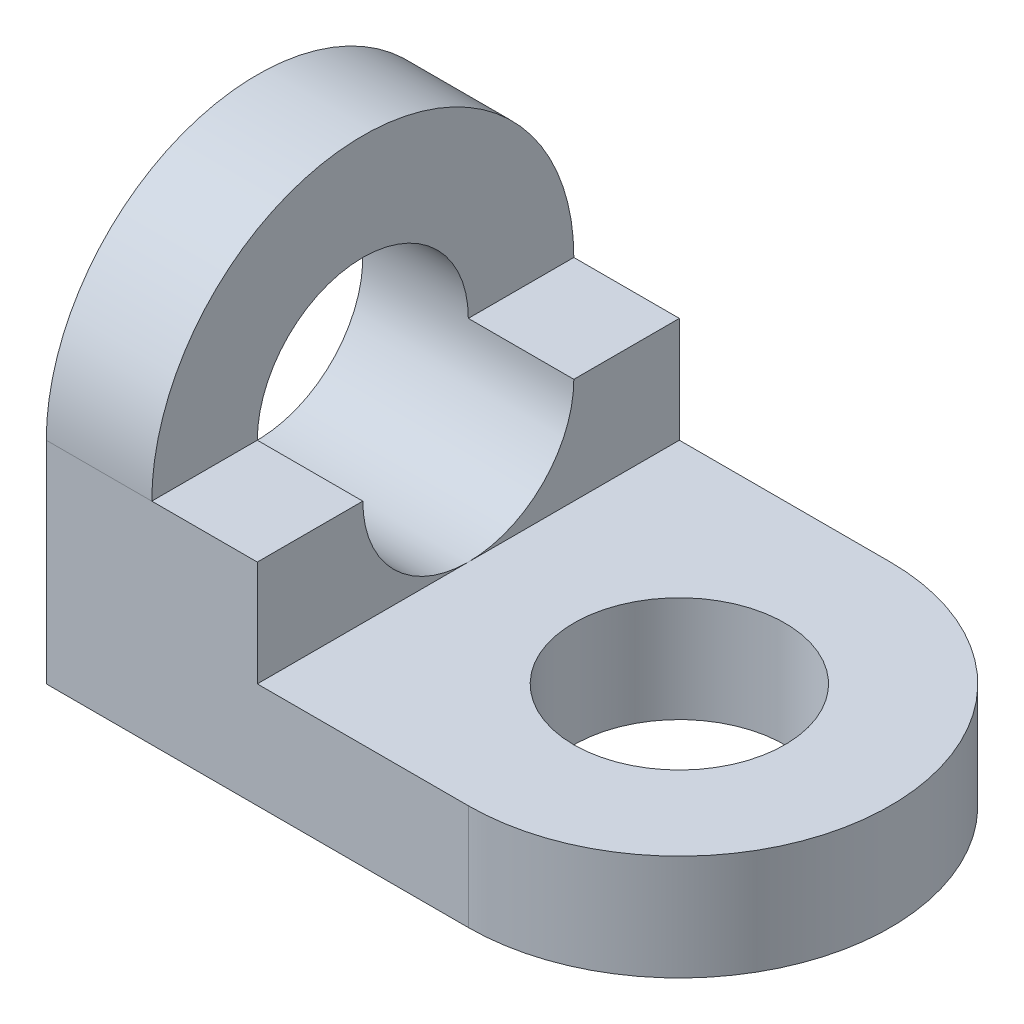
ISO-10303-21;
HEADER;
FILE_DESCRIPTION(('STEP AP214'),'2;1');
FILE_NAME('part.step','',(''),(''),'','','');
FILE_SCHEMA(('AUTOMOTIVE_DESIGN { 1 0 10303 214 1 1 1 1 }'));
ENDSEC;
DATA;
#1=APPLICATION_CONTEXT('core data for automotive mechanical design processes');
#2=APPLICATION_PROTOCOL_DEFINITION('international standard','automotive_design',2000,#1);
#3=PRODUCT_CONTEXT('',#1,'mechanical');
#4=PRODUCT('Part','Part','',(#3));
#5=PRODUCT_RELATED_PRODUCT_CATEGORY('part','',(#4));
#6=PRODUCT_DEFINITION_FORMATION('','',#4);
#7=PRODUCT_DEFINITION_CONTEXT('part definition',#1,'design');
#8=PRODUCT_DEFINITION('design','',#6,#7);
#9=PRODUCT_DEFINITION_SHAPE('','',#8);
#10=(LENGTH_UNIT() NAMED_UNIT(*) SI_UNIT(.MILLI.,.METRE.));
#11=(NAMED_UNIT(*) PLANE_ANGLE_UNIT() SI_UNIT($,.RADIAN.));
#12=(NAMED_UNIT(*) SI_UNIT($,.STERADIAN.) SOLID_ANGLE_UNIT());
#13=UNCERTAINTY_MEASURE_WITH_UNIT(LENGTH_MEASURE(1.E-05),#10,'distance_accuracy_value','');
#14=(GEOMETRIC_REPRESENTATION_CONTEXT(3) GLOBAL_UNCERTAINTY_ASSIGNED_CONTEXT((#13)) GLOBAL_UNIT_ASSIGNED_CONTEXT((#10,
#11,#12)) REPRESENTATION_CONTEXT('',''));
#15=CARTESIAN_POINT('',(0.,0.,0.));
#16=DIRECTION('',(0.,0.,1.));
#17=DIRECTION('',(1.,0.,0.));
#18=AXIS2_PLACEMENT_3D('',#15,#16,#17);
#19=CARTESIAN_POINT('',(0.,5.,0.));
#20=DIRECTION('',(0.,1.,0.));
#21=DIRECTION('',(0.,0.,1.));
#22=AXIS2_PLACEMENT_3D('',#19,#20,#21);
#23=PLANE('',#22);
#24=DIRECTION('',(0.,0.,-1.));
#25=VECTOR('',#24,1.);
#26=CARTESIAN_POINT('',(-9.99999999999999,5.,0.));
#27=LINE('',#26,#25);
#28=CARTESIAN_POINT('',(-9.99999999999999,5.,0.));
#29=VERTEX_POINT('',#28);
#30=CARTESIAN_POINT('',(-10.,5.,-10.));
#31=VERTEX_POINT('',#30);
#32=EDGE_CURVE('E139',#29,#31,#27,.T.);
#33=ORIENTED_EDGE('',*,*,#32,.F.);
#34=DIRECTION('',(0.,0.,-1.));
#35=VECTOR('',#34,1.);
#36=CARTESIAN_POINT('',(-9.99999999999999,5.,0.));
#37=LINE('',#36,#35);
#38=CARTESIAN_POINT('',(-9.99999999999999,5.,10.));
#39=VERTEX_POINT('',#38);
#40=EDGE_CURVE('E168',#39,#29,#37,.T.);
#41=ORIENTED_EDGE('',*,*,#40,.F.);
#42=DIRECTION('',(1.,0.,0.));
#43=VECTOR('',#42,1.);
#44=CARTESIAN_POINT('',(-20.,5.,10.));
#45=LINE('',#44,#43);
#46=CARTESIAN_POINT('',(0.,5.,10.));
#47=VERTEX_POINT('',#46);
#48=EDGE_CURVE('E204',#39,#47,#45,.T.);
#49=ORIENTED_EDGE('',*,*,#48,.T.);
#50=CARTESIAN_POINT('',(0.,5.,0.));
#51=DIRECTION('',(0.,1.,0.));
#52=DIRECTION('',(0.,0.,1.));
#53=AXIS2_PLACEMENT_3D('',#50,#51,#52);
#54=CIRCLE('',#53,10.);
#55=CARTESIAN_POINT('',(0.,5.,-10.));
#56=VERTEX_POINT('',#55);
#57=EDGE_CURVE('E200',#47,#56,#54,.T.);
#58=ORIENTED_EDGE('',*,*,#57,.T.);
#59=DIRECTION('',(-1.,0.,0.));
#60=VECTOR('',#59,1.);
#61=CARTESIAN_POINT('',(0.,5.,-10.));
#62=LINE('',#61,#60);
#63=EDGE_CURVE('E74',#56,#31,#62,.T.);
#64=ORIENTED_EDGE('',*,*,#63,.T.);
#65=EDGE_LOOP('',(#33,#41,#49,#58,#64));
#66=FACE_BOUND('',#65,.T.);
#67=CARTESIAN_POINT('',(0.,5.,0.));
#68=DIRECTION('',(0.,1.,0.));
#69=DIRECTION('',(0.,0.,1.));
#70=AXIS2_PLACEMENT_3D('',#67,#68,#69);
#71=CIRCLE('',#70,5.);
#72=CARTESIAN_POINT('',(0.,5.,5.));
#73=VERTEX_POINT('',#72);
#74=EDGE_CURVE('E194',#73,#73,#71,.T.);
#75=ORIENTED_EDGE('',*,*,#74,.F.);
#76=EDGE_LOOP('',(#75));
#77=FACE_BOUND('',#76,.T.);
#78=ADVANCED_FACE('F59',(#66,#77),#23,.T.);
#79=CARTESIAN_POINT('',(0.,0.,0.));
#80=DIRECTION('',(0.,1.,0.));
#81=DIRECTION('',(0.,0.,1.));
#82=AXIS2_PLACEMENT_3D('',#79,#80,#81);
#83=PLANE('',#82);
#84=CARTESIAN_POINT('',(0.,0.,0.));
#85=DIRECTION('',(0.,1.,0.));
#86=DIRECTION('',(0.,0.,1.));
#87=AXIS2_PLACEMENT_3D('',#84,#85,#86);
#88=CIRCLE('',#87,10.);
#89=CARTESIAN_POINT('',(0.,0.,10.));
#90=VERTEX_POINT('',#89);
#91=CARTESIAN_POINT('',(0.,0.,-10.));
#92=VERTEX_POINT('',#91);
#93=EDGE_CURVE('E197',#90,#92,#88,.T.);
#94=ORIENTED_EDGE('',*,*,#93,.F.);
#95=DIRECTION('',(1.,0.,0.));
#96=VECTOR('',#95,1.);
#97=CARTESIAN_POINT('',(-20.,0.,10.));
#98=LINE('',#97,#96);
#99=CARTESIAN_POINT('',(-20.,0.,10.));
#100=VERTEX_POINT('',#99);
#101=EDGE_CURVE('E202',#100,#90,#98,.T.);
#102=ORIENTED_EDGE('',*,*,#101,.F.);
#103=DIRECTION('',(0.,0.,1.));
#104=VECTOR('',#103,1.);
#105=CARTESIAN_POINT('',(-20.,0.,-10.));
#106=LINE('',#105,#104);
#107=CARTESIAN_POINT('',(-20.,0.,-10.));
#108=VERTEX_POINT('',#107);
#109=EDGE_CURVE('E211',#108,#100,#106,.T.);
#110=ORIENTED_EDGE('',*,*,#109,.F.);
#111=DIRECTION('',(-1.,0.,0.));
#112=VECTOR('',#111,1.);
#113=CARTESIAN_POINT('',(0.,0.,-10.));
#114=LINE('',#113,#112);
#115=EDGE_CURVE('E209',#92,#108,#114,.T.);
#116=ORIENTED_EDGE('',*,*,#115,.F.);
#117=EDGE_LOOP('',(#94,#102,#110,#116));
#118=FACE_BOUND('',#117,.T.);
#119=CARTESIAN_POINT('',(0.,0.,0.));
#120=DIRECTION('',(0.,1.,0.));
#121=DIRECTION('',(0.,0.,1.));
#122=AXIS2_PLACEMENT_3D('',#119,#120,#121);
#123=CIRCLE('',#122,5.);
#124=CARTESIAN_POINT('',(0.,0.,5.));
#125=VERTEX_POINT('',#124);
#126=EDGE_CURVE('E191',#125,#125,#123,.T.);
#127=ORIENTED_EDGE('',*,*,#126,.T.);
#128=EDGE_LOOP('',(#127));
#129=FACE_BOUND('',#128,.T.);
#130=ADVANCED_FACE('F226',(#118,#129),#83,.F.);
#131=CARTESIAN_POINT('',(0.,5.,0.));
#132=DIRECTION('',(0.,-1.,0.));
#133=DIRECTION('',(0.,0.,-1.));
#134=AXIS2_PLACEMENT_3D('',#131,#132,#133);
#135=CYLINDRICAL_SURFACE('',#134,10.);
#136=ORIENTED_EDGE('',*,*,#93,.T.);
#137=DIRECTION('',(0.,-1.,0.));
#138=VECTOR('',#137,1.);
#139=CARTESIAN_POINT('',(0.,5.,-10.));
#140=LINE('',#139,#138);
#141=EDGE_CURVE('E12',#56,#92,#140,.T.);
#142=ORIENTED_EDGE('',*,*,#141,.F.);
#143=ORIENTED_EDGE('',*,*,#57,.F.);
#144=DIRECTION('',(0.,-1.,0.));
#145=VECTOR('',#144,1.);
#146=CARTESIAN_POINT('',(0.,5.,10.));
#147=LINE('',#146,#145);
#148=EDGE_CURVE('E206',#47,#90,#147,.T.);
#149=ORIENTED_EDGE('',*,*,#148,.T.);
#150=EDGE_LOOP('',(#136,#142,#143,#149));
#151=FACE_BOUND('',#150,.T.);
#152=ADVANCED_FACE('F61',(#151),#135,.T.);
#153=CARTESIAN_POINT('',(0.,5.,-10.));
#154=DIRECTION('',(0.,0.,1.));
#155=DIRECTION('',(1.,0.,0.));
#156=AXIS2_PLACEMENT_3D('',#153,#154,#155);
#157=PLANE('',#156);
#158=ORIENTED_EDGE('',*,*,#115,.T.);
#159=DIRECTION('',(0.,-1.,0.));
#160=VECTOR('',#159,1.);
#161=CARTESIAN_POINT('',(-20.,5.,-10.));
#162=LINE('',#161,#160);
#163=CARTESIAN_POINT('',(-20.,10.,-10.));
#164=VERTEX_POINT('',#163);
#165=EDGE_CURVE('E67',#164,#108,#162,.T.);
#166=ORIENTED_EDGE('',*,*,#165,.F.);
#167=DIRECTION('',(-1.,0.,0.));
#168=VECTOR('',#167,1.);
#169=CARTESIAN_POINT('',(-15.,10.,-10.));
#170=LINE('',#169,#168);
#171=CARTESIAN_POINT('',(-15.,10.,-10.));
#172=VERTEX_POINT('',#171);
#173=EDGE_CURVE('E148',#172,#164,#170,.T.);
#174=ORIENTED_EDGE('',*,*,#173,.F.);
#175=DIRECTION('',(-1.,0.,0.));
#176=VECTOR('',#175,1.);
#177=CARTESIAN_POINT('',(-10.,10.,-10.));
#178=LINE('',#177,#176);
#179=CARTESIAN_POINT('',(-10.,10.,-10.));
#180=VERTEX_POINT('',#179);
#181=EDGE_CURVE('E145',#180,#172,#178,.T.);
#182=ORIENTED_EDGE('',*,*,#181,.F.);
#183=DIRECTION('',(0.,1.,0.));
#184=VECTOR('',#183,1.);
#185=CARTESIAN_POINT('',(-10.,0.,-10.));
#186=LINE('',#185,#184);
#187=EDGE_CURVE('E133',#31,#180,#186,.T.);
#188=ORIENTED_EDGE('',*,*,#187,.F.);
#189=ORIENTED_EDGE('',*,*,#63,.F.);
#190=ORIENTED_EDGE('',*,*,#141,.T.);
#191=EDGE_LOOP('',(#158,#166,#174,#182,#188,#189,#190));
#192=FACE_BOUND('',#191,.T.);
#193=ADVANCED_FACE('F146',(#192),#157,.F.);
#194=CARTESIAN_POINT('',(-20.,5.,-10.));
#195=DIRECTION('',(1.,0.,0.));
#196=DIRECTION('',(0.,0.,-1.));
#197=AXIS2_PLACEMENT_3D('',#194,#195,#196);
#198=PLANE('',#197);
#199=CARTESIAN_POINT('',(-20.,10.,0.));
#200=DIRECTION('',(-1.,0.,0.));
#201=DIRECTION('',(0.,0.,1.));
#202=AXIS2_PLACEMENT_3D('',#199,#200,#201);
#203=CIRCLE('',#202,5.);
#204=CARTESIAN_POINT('',(-20.,10.,5.));
#205=VERTEX_POINT('',#204);
#206=EDGE_CURVE('E180',#205,#205,#203,.T.);
#207=ORIENTED_EDGE('',*,*,#206,.F.);
#208=EDGE_LOOP('',(#207));
#209=FACE_BOUND('',#208,.T.);
#210=ORIENTED_EDGE('',*,*,#109,.T.);
#211=DIRECTION('',(0.,-1.,0.));
#212=VECTOR('',#211,1.);
#213=CARTESIAN_POINT('',(-20.,5.,10.));
#214=LINE('',#213,#212);
#215=CARTESIAN_POINT('',(-20.,10.,10.));
#216=VERTEX_POINT('',#215);
#217=EDGE_CURVE('E216',#216,#100,#214,.T.);
#218=ORIENTED_EDGE('',*,*,#217,.F.);
#219=CARTESIAN_POINT('',(-20.,10.,0.));
#220=DIRECTION('',(-1.,0.,0.));
#221=DIRECTION('',(0.,0.,-1.));
#222=AXIS2_PLACEMENT_3D('',#219,#220,#221);
#223=CIRCLE('',#222,10.);
#224=EDGE_CURVE('E182',#216,#164,#223,.T.);
#225=ORIENTED_EDGE('',*,*,#224,.T.);
#226=ORIENTED_EDGE('',*,*,#165,.T.);
#227=EDGE_LOOP('',(#210,#218,#225,#226));
#228=FACE_BOUND('',#227,.T.);
#229=ADVANCED_FACE('F221',(#209,#228),#198,.F.);
#230=CARTESIAN_POINT('',(-20.,5.,10.));
#231=DIRECTION('',(0.,0.,-1.));
#232=DIRECTION('',(-1.,0.,0.));
#233=AXIS2_PLACEMENT_3D('',#230,#231,#232);
#234=PLANE('',#233);
#235=ORIENTED_EDGE('',*,*,#48,.F.);
#236=DIRECTION('',(0.,-1.,0.));
#237=VECTOR('',#236,1.);
#238=CARTESIAN_POINT('',(-9.99999999999999,0.,10.));
#239=LINE('',#238,#237);
#240=CARTESIAN_POINT('',(-9.99999999999999,10.,10.));
#241=VERTEX_POINT('',#240);
#242=EDGE_CURVE('E164',#241,#39,#239,.T.);
#243=ORIENTED_EDGE('',*,*,#242,.F.);
#244=DIRECTION('',(-1.,0.,0.));
#245=VECTOR('',#244,1.);
#246=CARTESIAN_POINT('',(-9.99999999999999,10.,10.));
#247=LINE('',#246,#245);
#248=CARTESIAN_POINT('',(-15.,10.,10.));
#249=VERTEX_POINT('',#248);
#250=EDGE_CURVE('E177',#241,#249,#247,.T.);
#251=ORIENTED_EDGE('',*,*,#250,.T.);
#252=DIRECTION('',(-1.,0.,0.));
#253=VECTOR('',#252,1.);
#254=CARTESIAN_POINT('',(-15.,10.,10.));
#255=LINE('',#254,#253);
#256=EDGE_CURVE('E187',#249,#216,#255,.T.);
#257=ORIENTED_EDGE('',*,*,#256,.T.);
#258=ORIENTED_EDGE('',*,*,#217,.T.);
#259=ORIENTED_EDGE('',*,*,#101,.T.);
#260=ORIENTED_EDGE('',*,*,#148,.F.);
#261=EDGE_LOOP('',(#235,#243,#251,#257,#258,#259,#260));
#262=FACE_BOUND('',#261,.T.);
#263=ADVANCED_FACE('F231',(#262),#234,.F.);
#264=CARTESIAN_POINT('',(0.,5.,0.));
#265=DIRECTION('',(0.,-1.,0.));
#266=DIRECTION('',(0.,0.,-1.));
#267=AXIS2_PLACEMENT_3D('',#264,#265,#266);
#268=CYLINDRICAL_SURFACE('',#267,5.);
#269=ORIENTED_EDGE('',*,*,#74,.T.);
#270=EDGE_LOOP('',(#269));
#271=FACE_BOUND('',#270,.T.);
#272=ORIENTED_EDGE('',*,*,#126,.F.);
#273=EDGE_LOOP('',(#272));
#274=FACE_BOUND('',#273,.T.);
#275=ADVANCED_FACE('F269',(#271,#274),#268,.F.);
#276=CARTESIAN_POINT('',(-15.,10.,0.));
#277=DIRECTION('',(-1.,0.,0.));
#278=DIRECTION('',(0.,0.,1.));
#279=AXIS2_PLACEMENT_3D('',#276,#277,#278);
#280=CYLINDRICAL_SURFACE('',#279,10.);
#281=ORIENTED_EDGE('',*,*,#224,.F.);
#282=ORIENTED_EDGE('',*,*,#256,.F.);
#283=CARTESIAN_POINT('',(-15.,10.,0.));
#284=DIRECTION('',(-1.,0.,0.));
#285=DIRECTION('',(0.,0.,-1.));
#286=AXIS2_PLACEMENT_3D('',#283,#284,#285);
#287=CIRCLE('',#286,10.);
#288=EDGE_CURVE('E185',#249,#172,#287,.T.);
#289=ORIENTED_EDGE('',*,*,#288,.T.);
#290=ORIENTED_EDGE('',*,*,#173,.T.);
#291=EDGE_LOOP('',(#281,#282,#289,#290));
#292=FACE_BOUND('',#291,.T.);
#293=ADVANCED_FACE('F247',(#292),#280,.T.);
#294=CARTESIAN_POINT('',(-15.,10.,0.));
#295=DIRECTION('',(1.,0.,0.));
#296=DIRECTION('',(0.,0.,-1.));
#297=AXIS2_PLACEMENT_3D('',#294,#295,#296);
#298=PLANE('',#297);
#299=DIRECTION('',(0.,0.,-1.));
#300=VECTOR('',#299,1.);
#301=CARTESIAN_POINT('',(-15.,10.,0.));
#302=LINE('',#301,#300);
#303=CARTESIAN_POINT('',(-15.,10.,-5.));
#304=VERTEX_POINT('',#303);
#305=EDGE_CURVE('E141',#304,#172,#302,.T.);
#306=ORIENTED_EDGE('',*,*,#305,.T.);
#307=ORIENTED_EDGE('',*,*,#288,.F.);
#308=DIRECTION('',(0.,0.,-1.));
#309=VECTOR('',#308,1.);
#310=CARTESIAN_POINT('',(-15.,10.,0.));
#311=LINE('',#310,#309);
#312=CARTESIAN_POINT('',(-15.,10.,5.));
#313=VERTEX_POINT('',#312);
#314=EDGE_CURVE('E165',#249,#313,#311,.T.);
#315=ORIENTED_EDGE('',*,*,#314,.T.);
#316=CARTESIAN_POINT('',(-15.,10.,0.));
#317=DIRECTION('',(-1.,0.,0.));
#318=DIRECTION('',(0.,0.,1.));
#319=AXIS2_PLACEMENT_3D('',#316,#317,#318);
#320=CIRCLE('',#319,5.);
#321=EDGE_CURVE('E82',#313,#304,#320,.T.);
#322=ORIENTED_EDGE('',*,*,#321,.T.);
#323=EDGE_LOOP('',(#306,#307,#315,#322));
#324=FACE_BOUND('',#323,.T.);
#325=ADVANCED_FACE('F248',(#324),#298,.T.);
#326=CARTESIAN_POINT('',(-15.,10.,0.));
#327=DIRECTION('',(-1.,0.,0.));
#328=DIRECTION('',(0.,0.,1.));
#329=AXIS2_PLACEMENT_3D('',#326,#327,#328);
#330=CYLINDRICAL_SURFACE('',#329,5.);
#331=ORIENTED_EDGE('',*,*,#206,.T.);
#332=EDGE_LOOP('',(#331));
#333=FACE_BOUND('',#332,.T.);
#334=ORIENTED_EDGE('',*,*,#321,.F.);
#335=DIRECTION('',(-1.,0.,0.));
#336=VECTOR('',#335,1.);
#337=CARTESIAN_POINT('',(-9.99999999999999,10.,5.));
#338=LINE('',#337,#336);
#339=CARTESIAN_POINT('',(-9.99999999999999,10.,5.));
#340=VERTEX_POINT('',#339);
#341=EDGE_CURVE('E173',#340,#313,#338,.T.);
#342=ORIENTED_EDGE('',*,*,#341,.F.);
#343=CARTESIAN_POINT('',(-9.99999999999999,10.,0.));
#344=DIRECTION('',(1.,0.,0.));
#345=DIRECTION('',(0.,0.,-1.));
#346=AXIS2_PLACEMENT_3D('',#343,#344,#345);
#347=CIRCLE('',#346,5.);
#348=EDGE_CURVE('E171',#29,#340,#347,.F.);
#349=ORIENTED_EDGE('',*,*,#348,.F.);
#350=CARTESIAN_POINT('',(-9.99999999999999,10.,0.));
#351=DIRECTION('',(1.,0.,0.));
#352=DIRECTION('',(0.,0.,-1.));
#353=AXIS2_PLACEMENT_3D('',#350,#351,#352);
#354=CIRCLE('',#353,5.);
#355=CARTESIAN_POINT('',(-10.,10.,-5.));
#356=VERTEX_POINT('',#355);
#357=EDGE_CURVE('E159',#356,#29,#354,.F.);
#358=ORIENTED_EDGE('',*,*,#357,.F.);
#359=DIRECTION('',(-1.,0.,0.));
#360=VECTOR('',#359,1.);
#361=CARTESIAN_POINT('',(-10.,10.,-5.));
#362=LINE('',#361,#360);
#363=EDGE_CURVE('E152',#356,#304,#362,.T.);
#364=ORIENTED_EDGE('',*,*,#363,.T.);
#365=EDGE_LOOP('',(#334,#342,#349,#358,#364));
#366=FACE_BOUND('',#365,.T.);
#367=ADVANCED_FACE('F252',(#333,#366),#330,.F.);
#368=CARTESIAN_POINT('',(-9.99999999999999,10.,0.));
#369=DIRECTION('',(0.,1.,0.));
#370=DIRECTION('',(0.,0.,1.));
#371=AXIS2_PLACEMENT_3D('',#368,#369,#370);
#372=PLANE('',#371);
#373=ORIENTED_EDGE('',*,*,#314,.F.);
#374=ORIENTED_EDGE('',*,*,#250,.F.);
#375=DIRECTION('',(0.,0.,-1.));
#376=VECTOR('',#375,1.);
#377=CARTESIAN_POINT('',(-9.99999999999999,10.,0.));
#378=LINE('',#377,#376);
#379=EDGE_CURVE('E161',#241,#340,#378,.T.);
#380=ORIENTED_EDGE('',*,*,#379,.T.);
#381=ORIENTED_EDGE('',*,*,#341,.T.);
#382=EDGE_LOOP('',(#373,#374,#380,#381));
#383=FACE_BOUND('',#382,.T.);
#384=ADVANCED_FACE('F244',(#383),#372,.T.);
#385=CARTESIAN_POINT('',(-9.99999999999999,0.,0.));
#386=DIRECTION('',(1.,0.,0.));
#387=DIRECTION('',(0.,0.,-1.));
#388=AXIS2_PLACEMENT_3D('',#385,#386,#387);
#389=PLANE('',#388);
#390=ORIENTED_EDGE('',*,*,#379,.F.);
#391=ORIENTED_EDGE('',*,*,#242,.T.);
#392=ORIENTED_EDGE('',*,*,#40,.T.);
#393=ORIENTED_EDGE('',*,*,#348,.T.);
#394=EDGE_LOOP('',(#390,#391,#392,#393));
#395=FACE_BOUND('',#394,.T.);
#396=ADVANCED_FACE('F239',(#395),#389,.T.);
#397=CARTESIAN_POINT('',(-9.99999999999999,10.,0.));
#398=DIRECTION('',(0.,1.,0.));
#399=DIRECTION('',(0.,0.,1.));
#400=AXIS2_PLACEMENT_3D('',#397,#398,#399);
#401=PLANE('',#400);
#402=ORIENTED_EDGE('',*,*,#305,.F.);
#403=ORIENTED_EDGE('',*,*,#363,.F.);
#404=DIRECTION('',(0.,0.,-1.));
#405=VECTOR('',#404,1.);
#406=CARTESIAN_POINT('',(-9.99999999999999,10.,0.));
#407=LINE('',#406,#405);
#408=EDGE_CURVE('E138',#356,#180,#407,.T.);
#409=ORIENTED_EDGE('',*,*,#408,.T.);
#410=ORIENTED_EDGE('',*,*,#181,.T.);
#411=EDGE_LOOP('',(#402,#403,#409,#410));
#412=FACE_BOUND('',#411,.T.);
#413=ADVANCED_FACE('F154',(#412),#401,.T.);
#414=CARTESIAN_POINT('',(-9.99999999999999,0.,0.));
#415=DIRECTION('',(1.,0.,0.));
#416=DIRECTION('',(0.,0.,-1.));
#417=AXIS2_PLACEMENT_3D('',#414,#415,#416);
#418=PLANE('',#417);
#419=ORIENTED_EDGE('',*,*,#408,.F.);
#420=ORIENTED_EDGE('',*,*,#357,.T.);
#421=ORIENTED_EDGE('',*,*,#32,.T.);
#422=ORIENTED_EDGE('',*,*,#187,.T.);
#423=EDGE_LOOP('',(#419,#420,#421,#422));
#424=FACE_BOUND('',#423,.T.);
#425=ADVANCED_FACE('F135',(#424),#418,.T.);
#426=CLOSED_SHELL('',(#78,#130,#152,#193,#229,#263,#275,#293,#325,#367,#384,#396,#413,#425));
#427=MANIFOLD_SOLID_BREP('B2',#426);
#428=ADVANCED_BREP_SHAPE_REPRESENTATION('',(#18,#427),#14);
#429=SHAPE_DEFINITION_REPRESENTATION(#9,#428);
ENDSEC;
END-ISO-10303-21;
